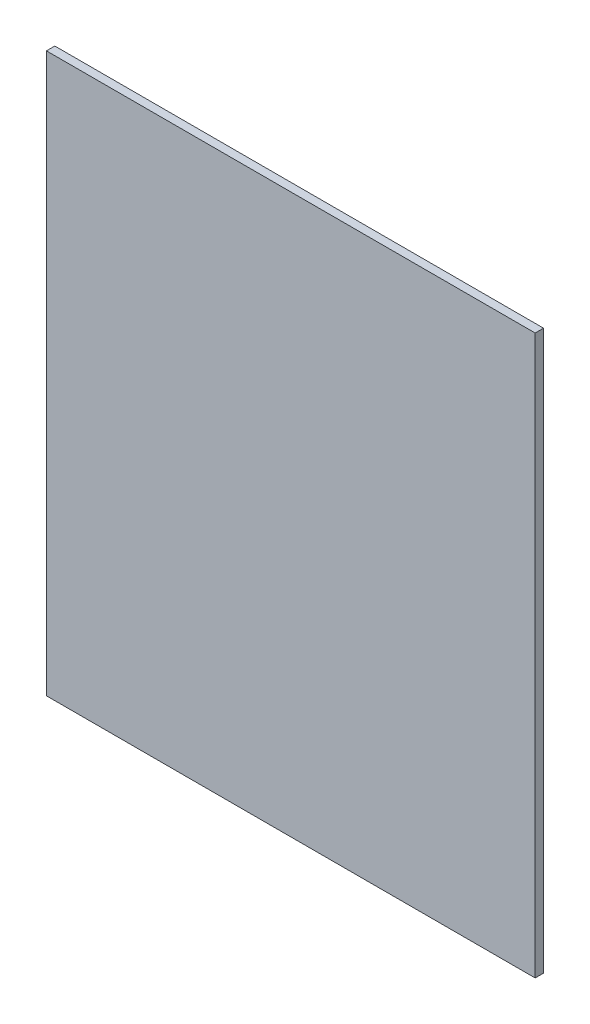
ISO-10303-21;
HEADER;
FILE_DESCRIPTION(('STEP AP214'),'2;1');
FILE_NAME('part.step','',(''),(''),'','','');
FILE_SCHEMA(('AUTOMOTIVE_DESIGN { 1 0 10303 214 1 1 1 1 }'));
ENDSEC;
DATA;
#1=APPLICATION_CONTEXT('core data for automotive mechanical design processes');
#2=APPLICATION_PROTOCOL_DEFINITION('international standard','automotive_design',2000,#1);
#3=PRODUCT_CONTEXT('',#1,'mechanical');
#4=PRODUCT('Part','Part','',(#3));
#5=PRODUCT_RELATED_PRODUCT_CATEGORY('part','',(#4));
#6=PRODUCT_DEFINITION_FORMATION('','',#4);
#7=PRODUCT_DEFINITION_CONTEXT('part definition',#1,'design');
#8=PRODUCT_DEFINITION('design','',#6,#7);
#9=PRODUCT_DEFINITION_SHAPE('','',#8);
#10=(LENGTH_UNIT() NAMED_UNIT(*) SI_UNIT(.MILLI.,.METRE.));
#11=(NAMED_UNIT(*) PLANE_ANGLE_UNIT() SI_UNIT($,.RADIAN.));
#12=(NAMED_UNIT(*) SI_UNIT($,.STERADIAN.) SOLID_ANGLE_UNIT());
#13=UNCERTAINTY_MEASURE_WITH_UNIT(LENGTH_MEASURE(1.E-05),#10,'distance_accuracy_value','');
#14=(GEOMETRIC_REPRESENTATION_CONTEXT(3) GLOBAL_UNCERTAINTY_ASSIGNED_CONTEXT((#13)) GLOBAL_UNIT_ASSIGNED_CONTEXT((#10,
#11,#12)) REPRESENTATION_CONTEXT('',''));
#15=CARTESIAN_POINT('',(0.,0.,0.));
#16=DIRECTION('',(0.,0.,1.));
#17=DIRECTION('',(1.,0.,0.));
#18=AXIS2_PLACEMENT_3D('',#15,#16,#17);
#19=CARTESIAN_POINT('',(-28.5714285714286,377.104761904762,6.));
#20=DIRECTION('',(1.,0.,0.));
#21=DIRECTION('',(0.,1.,0.));
#22=AXIS2_PLACEMENT_3D('',#19,#20,#21);
#23=PLANE('',#22);
#24=DIRECTION('',(0.,-1.,0.));
#25=VECTOR('',#24,1.);
#26=CARTESIAN_POINT('',(-28.5714285714286,377.104761904762,0.));
#27=LINE('',#26,#25);
#28=CARTESIAN_POINT('',(-28.5714285714286,377.104761904762,0.));
#29=VERTEX_POINT('',#28);
#30=CARTESIAN_POINT('',(-28.5714285714286,-22.8952380952381,0.));
#31=VERTEX_POINT('',#30);
#32=EDGE_CURVE('E96',#29,#31,#27,.T.);
#33=ORIENTED_EDGE('',*,*,#32,.T.);
#34=DIRECTION('',(0.,0.,-1.));
#35=VECTOR('',#34,1.);
#36=CARTESIAN_POINT('',(-28.5714285714286,-22.8952380952381,6.));
#37=LINE('',#36,#35);
#38=CARTESIAN_POINT('',(-28.5714285714286,-22.8952380952381,6.));
#39=VERTEX_POINT('',#38);
#40=EDGE_CURVE('E11',#39,#31,#37,.T.);
#41=ORIENTED_EDGE('',*,*,#40,.F.);
#42=DIRECTION('',(0.,-1.,0.));
#43=VECTOR('',#42,1.);
#44=CARTESIAN_POINT('',(-28.5714285714286,377.104761904762,6.));
#45=LINE('',#44,#43);
#46=CARTESIAN_POINT('',(-28.5714285714286,377.104761904762,6.));
#47=VERTEX_POINT('',#46);
#48=EDGE_CURVE('E84',#47,#39,#45,.T.);
#49=ORIENTED_EDGE('',*,*,#48,.F.);
#50=DIRECTION('',(0.,0.,-1.));
#51=VECTOR('',#50,1.);
#52=CARTESIAN_POINT('',(-28.5714285714286,377.104761904762,6.));
#53=LINE('',#52,#51);
#54=EDGE_CURVE('E92',#47,#29,#53,.T.);
#55=ORIENTED_EDGE('',*,*,#54,.T.);
#56=EDGE_LOOP('',(#33,#41,#49,#55));
#57=FACE_BOUND('',#56,.T.);
#58=ADVANCED_FACE('F33',(#57),#23,.F.);
#59=CARTESIAN_POINT('',(-28.5714285714286,-22.8952380952381,6.));
#60=DIRECTION('',(0.,1.,0.));
#61=DIRECTION('',(0.,0.,1.));
#62=AXIS2_PLACEMENT_3D('',#59,#60,#61);
#63=PLANE('',#62);
#64=DIRECTION('',(1.,0.,0.));
#65=VECTOR('',#64,1.);
#66=CARTESIAN_POINT('',(-28.5714285714286,-22.8952380952381,0.));
#67=LINE('',#66,#65);
#68=CARTESIAN_POINT('',(321.428571428571,-22.8952380952381,0.));
#69=VERTEX_POINT('',#68);
#70=EDGE_CURVE('E88',#31,#69,#67,.T.);
#71=ORIENTED_EDGE('',*,*,#70,.T.);
#72=DIRECTION('',(0.,0.,-1.));
#73=VECTOR('',#72,1.);
#74=CARTESIAN_POINT('',(321.428571428571,-22.8952380952381,6.));
#75=LINE('',#74,#73);
#76=CARTESIAN_POINT('',(321.428571428571,-22.8952380952381,6.));
#77=VERTEX_POINT('',#76);
#78=EDGE_CURVE('E41',#77,#69,#75,.T.);
#79=ORIENTED_EDGE('',*,*,#78,.F.);
#80=DIRECTION('',(1.,0.,0.));
#81=VECTOR('',#80,1.);
#82=CARTESIAN_POINT('',(-28.5714285714286,-22.8952380952381,6.));
#83=LINE('',#82,#81);
#84=EDGE_CURVE('E79',#39,#77,#83,.T.);
#85=ORIENTED_EDGE('',*,*,#84,.F.);
#86=ORIENTED_EDGE('',*,*,#40,.T.);
#87=EDGE_LOOP('',(#71,#79,#85,#86));
#88=FACE_BOUND('',#87,.T.);
#89=ADVANCED_FACE('F87',(#88),#63,.F.);
#90=CARTESIAN_POINT('',(321.428571428571,377.104761904762,6.));
#91=DIRECTION('',(-1.,0.,0.));
#92=DIRECTION('',(0.,-1.,0.));
#93=AXIS2_PLACEMENT_3D('',#90,#91,#92);
#94=PLANE('',#93);
#95=DIRECTION('',(0.,1.,0.));
#96=VECTOR('',#95,1.);
#97=CARTESIAN_POINT('',(321.428571428571,377.104761904762,0.));
#98=LINE('',#97,#96);
#99=CARTESIAN_POINT('',(321.428571428571,377.104761904762,0.));
#100=VERTEX_POINT('',#99);
#101=EDGE_CURVE('E66',#69,#100,#98,.T.);
#102=ORIENTED_EDGE('',*,*,#101,.T.);
#103=DIRECTION('',(0.,0.,-1.));
#104=VECTOR('',#103,1.);
#105=CARTESIAN_POINT('',(321.428571428571,377.104761904762,6.));
#106=LINE('',#105,#104);
#107=CARTESIAN_POINT('',(321.428571428571,377.104761904762,6.));
#108=VERTEX_POINT('',#107);
#109=EDGE_CURVE('E89',#108,#100,#106,.T.);
#110=ORIENTED_EDGE('',*,*,#109,.F.);
#111=DIRECTION('',(0.,1.,0.));
#112=VECTOR('',#111,1.);
#113=CARTESIAN_POINT('',(321.428571428571,377.104761904762,6.));
#114=LINE('',#113,#112);
#115=EDGE_CURVE('E82',#77,#108,#114,.T.);
#116=ORIENTED_EDGE('',*,*,#115,.F.);
#117=ORIENTED_EDGE('',*,*,#78,.T.);
#118=EDGE_LOOP('',(#102,#110,#116,#117));
#119=FACE_BOUND('',#118,.T.);
#120=ADVANCED_FACE('F90',(#119),#94,.F.);
#121=CARTESIAN_POINT('',(-28.5714285714286,377.104761904762,6.));
#122=DIRECTION('',(0.,-1.,0.));
#123=DIRECTION('',(0.,0.,-1.));
#124=AXIS2_PLACEMENT_3D('',#121,#122,#123);
#125=PLANE('',#124);
#126=DIRECTION('',(-1.,0.,0.));
#127=VECTOR('',#126,1.);
#128=CARTESIAN_POINT('',(-28.5714285714286,377.104761904762,0.));
#129=LINE('',#128,#127);
#130=EDGE_CURVE('E72',#100,#29,#129,.T.);
#131=ORIENTED_EDGE('',*,*,#130,.T.);
#132=ORIENTED_EDGE('',*,*,#54,.F.);
#133=DIRECTION('',(-1.,0.,0.));
#134=VECTOR('',#133,1.);
#135=CARTESIAN_POINT('',(-28.5714285714286,377.104761904762,6.));
#136=LINE('',#135,#134);
#137=EDGE_CURVE('E49',#108,#47,#136,.T.);
#138=ORIENTED_EDGE('',*,*,#137,.F.);
#139=ORIENTED_EDGE('',*,*,#109,.T.);
#140=EDGE_LOOP('',(#131,#132,#138,#139));
#141=FACE_BOUND('',#140,.T.);
#142=ADVANCED_FACE('F103',(#141),#125,.F.);
#143=CARTESIAN_POINT('',(0.,0.,6.));
#144=DIRECTION('',(0.,0.,1.));
#145=DIRECTION('',(1.,0.,0.));
#146=AXIS2_PLACEMENT_3D('',#143,#144,#145);
#147=PLANE('',#146);
#148=ORIENTED_EDGE('',*,*,#48,.T.);
#149=ORIENTED_EDGE('',*,*,#84,.T.);
#150=ORIENTED_EDGE('',*,*,#115,.T.);
#151=ORIENTED_EDGE('',*,*,#137,.T.);
#152=EDGE_LOOP('',(#148,#149,#150,#151));
#153=FACE_BOUND('',#152,.T.);
#154=ADVANCED_FACE('F80',(#153),#147,.T.);
#155=CARTESIAN_POINT('',(0.,0.,0.));
#156=DIRECTION('',(0.,0.,1.));
#157=DIRECTION('',(1.,0.,0.));
#158=AXIS2_PLACEMENT_3D('',#155,#156,#157);
#159=PLANE('',#158);
#160=ORIENTED_EDGE('',*,*,#32,.F.);
#161=ORIENTED_EDGE('',*,*,#130,.F.);
#162=ORIENTED_EDGE('',*,*,#101,.F.);
#163=ORIENTED_EDGE('',*,*,#70,.F.);
#164=EDGE_LOOP('',(#160,#161,#162,#163));
#165=FACE_BOUND('',#164,.T.);
#166=ADVANCED_FACE('F106',(#165),#159,.F.);
#167=CLOSED_SHELL('',(#58,#89,#120,#142,#154,#166));
#168=MANIFOLD_SOLID_BREP('B2',#167);
#169=ADVANCED_BREP_SHAPE_REPRESENTATION('',(#18,#168),#14);
#170=SHAPE_DEFINITION_REPRESENTATION(#9,#169);
ENDSEC;
END-ISO-10303-21;
